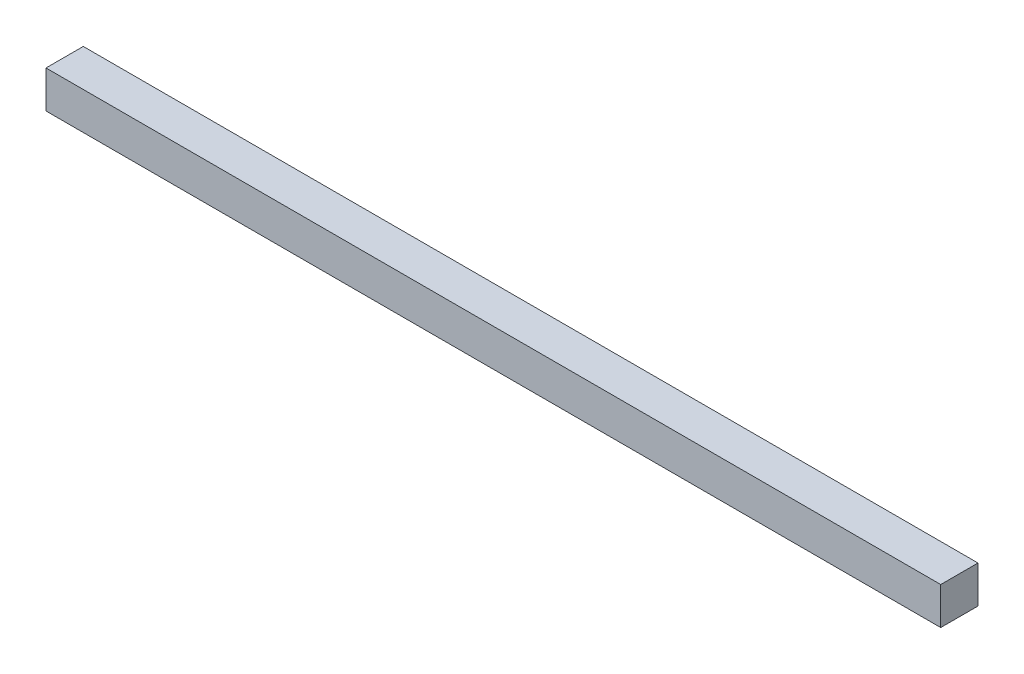
ISO-10303-21;
HEADER;
FILE_DESCRIPTION(('STEP AP214'),'2;1');
FILE_NAME('part.step','',(''),(''),'','','');
FILE_SCHEMA(('AUTOMOTIVE_DESIGN { 1 0 10303 214 1 1 1 1 }'));
ENDSEC;
DATA;
#1=APPLICATION_CONTEXT('core data for automotive mechanical design processes');
#2=APPLICATION_PROTOCOL_DEFINITION('international standard','automotive_design',2000,#1);
#3=PRODUCT_CONTEXT('',#1,'mechanical');
#4=PRODUCT('Part','Part','',(#3));
#5=PRODUCT_RELATED_PRODUCT_CATEGORY('part','',(#4));
#6=PRODUCT_DEFINITION_FORMATION('','',#4);
#7=PRODUCT_DEFINITION_CONTEXT('part definition',#1,'design');
#8=PRODUCT_DEFINITION('design','',#6,#7);
#9=PRODUCT_DEFINITION_SHAPE('','',#8);
#10=(LENGTH_UNIT() NAMED_UNIT(*) SI_UNIT(.MILLI.,.METRE.));
#11=(NAMED_UNIT(*) PLANE_ANGLE_UNIT() SI_UNIT($,.RADIAN.));
#12=(NAMED_UNIT(*) SI_UNIT($,.STERADIAN.) SOLID_ANGLE_UNIT());
#13=UNCERTAINTY_MEASURE_WITH_UNIT(LENGTH_MEASURE(1.E-05),#10,'distance_accuracy_value','');
#14=(GEOMETRIC_REPRESENTATION_CONTEXT(3) GLOBAL_UNCERTAINTY_ASSIGNED_CONTEXT((#13)) GLOBAL_UNIT_ASSIGNED_CONTEXT((#10,
#11,#12)) REPRESENTATION_CONTEXT('',''));
#15=CARTESIAN_POINT('',(0.,0.,0.));
#16=DIRECTION('',(0.,0.,1.));
#17=DIRECTION('',(1.,0.,0.));
#18=AXIS2_PLACEMENT_3D('',#15,#16,#17);
#19=CARTESIAN_POINT('',(0.,38.1,0.));
#20=DIRECTION('',(1.,0.,0.));
#21=DIRECTION('',(0.,0.,-1.));
#22=AXIS2_PLACEMENT_3D('',#19,#20,#21);
#23=PLANE('',#22);
#24=DIRECTION('',(0.,0.,1.));
#25=VECTOR('',#24,1.);
#26=CARTESIAN_POINT('',(0.,0.,0.));
#27=LINE('',#26,#25);
#28=CARTESIAN_POINT('',(0.,0.,-38.1));
#29=VERTEX_POINT('',#28);
#30=CARTESIAN_POINT('',(0.,0.,0.));
#31=VERTEX_POINT('',#30);
#32=EDGE_CURVE('E95',#29,#31,#27,.T.);
#33=ORIENTED_EDGE('',*,*,#32,.T.);
#34=DIRECTION('',(0.,-1.,0.));
#35=VECTOR('',#34,1.);
#36=CARTESIAN_POINT('',(0.,38.1,0.));
#37=LINE('',#36,#35);
#38=CARTESIAN_POINT('',(0.,38.1,0.));
#39=VERTEX_POINT('',#38);
#40=EDGE_CURVE('E11',#39,#31,#37,.T.);
#41=ORIENTED_EDGE('',*,*,#40,.F.);
#42=DIRECTION('',(0.,0.,1.));
#43=VECTOR('',#42,1.);
#44=CARTESIAN_POINT('',(0.,38.1,0.));
#45=LINE('',#44,#43);
#46=CARTESIAN_POINT('',(0.,38.1,-38.1));
#47=VERTEX_POINT('',#46);
#48=EDGE_CURVE('E83',#47,#39,#45,.T.);
#49=ORIENTED_EDGE('',*,*,#48,.F.);
#50=DIRECTION('',(0.,-1.,0.));
#51=VECTOR('',#50,1.);
#52=CARTESIAN_POINT('',(0.,38.1,-38.1));
#53=LINE('',#52,#51);
#54=EDGE_CURVE('E91',#47,#29,#53,.T.);
#55=ORIENTED_EDGE('',*,*,#54,.T.);
#56=EDGE_LOOP('',(#33,#41,#49,#55));
#57=FACE_BOUND('',#56,.T.);
#58=ADVANCED_FACE('F32',(#57),#23,.F.);
#59=CARTESIAN_POINT('',(0.,38.1,0.));
#60=DIRECTION('',(0.,0.,-1.));
#61=DIRECTION('',(-1.,0.,0.));
#62=AXIS2_PLACEMENT_3D('',#59,#60,#61);
#63=PLANE('',#62);
#64=DIRECTION('',(1.,0.,0.));
#65=VECTOR('',#64,1.);
#66=CARTESIAN_POINT('',(0.,0.,0.));
#67=LINE('',#66,#65);
#68=CARTESIAN_POINT('',(914.4,0.,0.));
#69=VERTEX_POINT('',#68);
#70=EDGE_CURVE('E87',#31,#69,#67,.T.);
#71=ORIENTED_EDGE('',*,*,#70,.T.);
#72=DIRECTION('',(0.,-1.,0.));
#73=VECTOR('',#72,1.);
#74=CARTESIAN_POINT('',(914.4,38.1,0.));
#75=LINE('',#74,#73);
#76=CARTESIAN_POINT('',(914.4,38.1,0.));
#77=VERTEX_POINT('',#76);
#78=EDGE_CURVE('E40',#77,#69,#75,.T.);
#79=ORIENTED_EDGE('',*,*,#78,.F.);
#80=DIRECTION('',(1.,0.,0.));
#81=VECTOR('',#80,1.);
#82=CARTESIAN_POINT('',(0.,38.1,0.));
#83=LINE('',#82,#81);
#84=EDGE_CURVE('E78',#39,#77,#83,.T.);
#85=ORIENTED_EDGE('',*,*,#84,.F.);
#86=ORIENTED_EDGE('',*,*,#40,.T.);
#87=EDGE_LOOP('',(#71,#79,#85,#86));
#88=FACE_BOUND('',#87,.T.);
#89=ADVANCED_FACE('F86',(#88),#63,.F.);
#90=CARTESIAN_POINT('',(914.4,38.1,0.));
#91=DIRECTION('',(-1.,0.,0.));
#92=DIRECTION('',(0.,0.,1.));
#93=AXIS2_PLACEMENT_3D('',#90,#91,#92);
#94=PLANE('',#93);
#95=DIRECTION('',(0.,0.,-1.));
#96=VECTOR('',#95,1.);
#97=CARTESIAN_POINT('',(914.4,0.,0.));
#98=LINE('',#97,#96);
#99=CARTESIAN_POINT('',(914.4,0.,-38.1));
#100=VERTEX_POINT('',#99);
#101=EDGE_CURVE('E65',#69,#100,#98,.T.);
#102=ORIENTED_EDGE('',*,*,#101,.T.);
#103=DIRECTION('',(0.,-1.,0.));
#104=VECTOR('',#103,1.);
#105=CARTESIAN_POINT('',(914.4,38.1,-38.1));
#106=LINE('',#105,#104);
#107=CARTESIAN_POINT('',(914.4,38.1,-38.1));
#108=VERTEX_POINT('',#107);
#109=EDGE_CURVE('E88',#108,#100,#106,.T.);
#110=ORIENTED_EDGE('',*,*,#109,.F.);
#111=DIRECTION('',(0.,0.,-1.));
#112=VECTOR('',#111,1.);
#113=CARTESIAN_POINT('',(914.4,38.1,0.));
#114=LINE('',#113,#112);
#115=EDGE_CURVE('E81',#77,#108,#114,.T.);
#116=ORIENTED_EDGE('',*,*,#115,.F.);
#117=ORIENTED_EDGE('',*,*,#78,.T.);
#118=EDGE_LOOP('',(#102,#110,#116,#117));
#119=FACE_BOUND('',#118,.T.);
#120=ADVANCED_FACE('F89',(#119),#94,.F.);
#121=CARTESIAN_POINT('',(0.,38.1,-38.1));
#122=DIRECTION('',(0.,0.,1.));
#123=DIRECTION('',(1.,0.,0.));
#124=AXIS2_PLACEMENT_3D('',#121,#122,#123);
#125=PLANE('',#124);
#126=DIRECTION('',(-1.,0.,0.));
#127=VECTOR('',#126,1.);
#128=CARTESIAN_POINT('',(0.,0.,-38.1));
#129=LINE('',#128,#127);
#130=EDGE_CURVE('E71',#100,#29,#129,.T.);
#131=ORIENTED_EDGE('',*,*,#130,.T.);
#132=ORIENTED_EDGE('',*,*,#54,.F.);
#133=DIRECTION('',(-1.,0.,0.));
#134=VECTOR('',#133,1.);
#135=CARTESIAN_POINT('',(0.,38.1,-38.1));
#136=LINE('',#135,#134);
#137=EDGE_CURVE('E48',#108,#47,#136,.T.);
#138=ORIENTED_EDGE('',*,*,#137,.F.);
#139=ORIENTED_EDGE('',*,*,#109,.T.);
#140=EDGE_LOOP('',(#131,#132,#138,#139));
#141=FACE_BOUND('',#140,.T.);
#142=ADVANCED_FACE('F102',(#141),#125,.F.);
#143=CARTESIAN_POINT('',(0.,38.1,-38.1));
#144=DIRECTION('',(0.,-1.,0.));
#145=DIRECTION('',(0.,0.,-1.));
#146=AXIS2_PLACEMENT_3D('',#143,#144,#145);
#147=PLANE('',#146);
#148=ORIENTED_EDGE('',*,*,#48,.T.);
#149=ORIENTED_EDGE('',*,*,#84,.T.);
#150=ORIENTED_EDGE('',*,*,#115,.T.);
#151=ORIENTED_EDGE('',*,*,#137,.T.);
#152=EDGE_LOOP('',(#148,#149,#150,#151));
#153=FACE_BOUND('',#152,.T.);
#154=ADVANCED_FACE('F79',(#153),#147,.F.);
#155=CARTESIAN_POINT('',(0.,0.,-38.1));
#156=DIRECTION('',(0.,-1.,0.));
#157=DIRECTION('',(0.,0.,-1.));
#158=AXIS2_PLACEMENT_3D('',#155,#156,#157);
#159=PLANE('',#158);
#160=ORIENTED_EDGE('',*,*,#32,.F.);
#161=ORIENTED_EDGE('',*,*,#130,.F.);
#162=ORIENTED_EDGE('',*,*,#101,.F.);
#163=ORIENTED_EDGE('',*,*,#70,.F.);
#164=EDGE_LOOP('',(#160,#161,#162,#163));
#165=FACE_BOUND('',#164,.T.);
#166=ADVANCED_FACE('F105',(#165),#159,.T.);
#167=CLOSED_SHELL('',(#58,#89,#120,#142,#154,#166));
#168=MANIFOLD_SOLID_BREP('B2',#167);
#169=ADVANCED_BREP_SHAPE_REPRESENTATION('',(#18,#168),#14);
#170=SHAPE_DEFINITION_REPRESENTATION(#9,#169);
ENDSEC;
END-ISO-10303-21;
